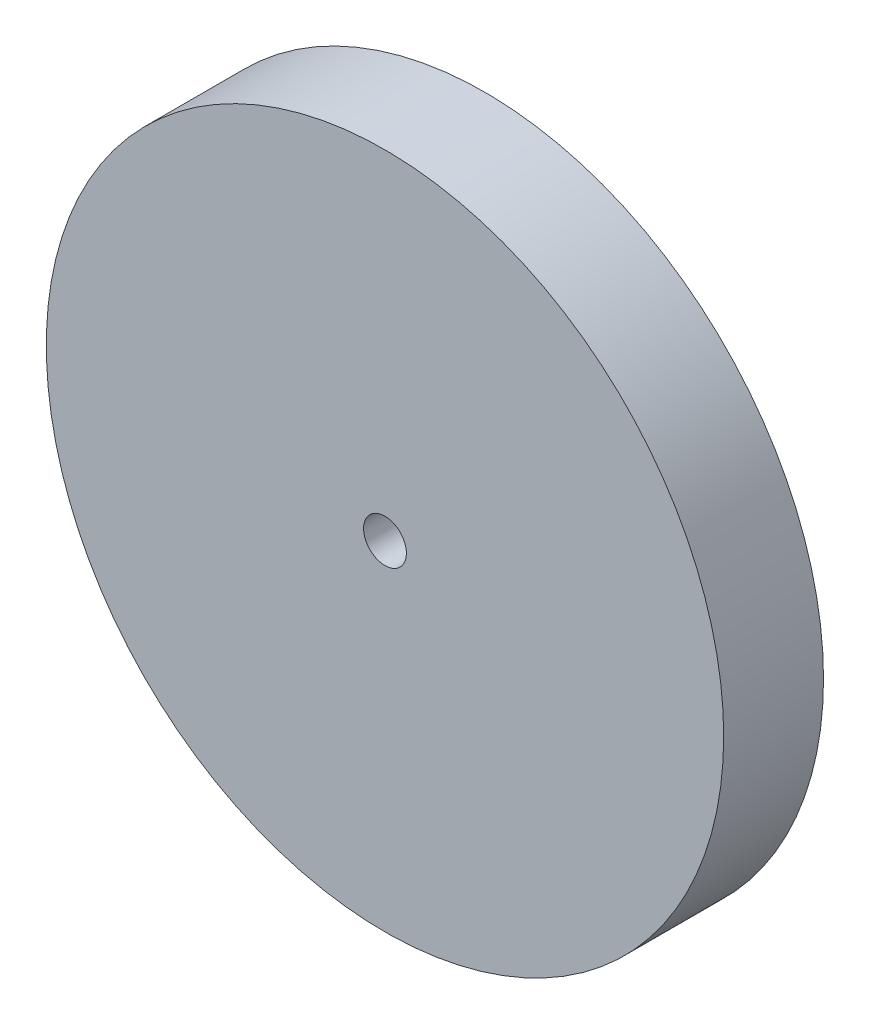
ISO-10303-21;
HEADER;
FILE_DESCRIPTION(('STEP AP214'),'2;1');
FILE_NAME('part.step','',(''),(''),'','','');
FILE_SCHEMA(('AUTOMOTIVE_DESIGN { 1 0 10303 214 1 1 1 1 }'));
ENDSEC;
DATA;
#1=APPLICATION_CONTEXT('core data for automotive mechanical design processes');
#2=APPLICATION_PROTOCOL_DEFINITION('international standard','automotive_design',2000,#1);
#3=PRODUCT_CONTEXT('',#1,'mechanical');
#4=PRODUCT('Part','Part','',(#3));
#5=PRODUCT_RELATED_PRODUCT_CATEGORY('part','',(#4));
#6=PRODUCT_DEFINITION_FORMATION('','',#4);
#7=PRODUCT_DEFINITION_CONTEXT('part definition',#1,'design');
#8=PRODUCT_DEFINITION('design','',#6,#7);
#9=PRODUCT_DEFINITION_SHAPE('','',#8);
#10=(LENGTH_UNIT() NAMED_UNIT(*) SI_UNIT(.MILLI.,.METRE.));
#11=(NAMED_UNIT(*) PLANE_ANGLE_UNIT() SI_UNIT($,.RADIAN.));
#12=(NAMED_UNIT(*) SI_UNIT($,.STERADIAN.) SOLID_ANGLE_UNIT());
#13=UNCERTAINTY_MEASURE_WITH_UNIT(LENGTH_MEASURE(1.E-05),#10,'distance_accuracy_value','');
#14=(GEOMETRIC_REPRESENTATION_CONTEXT(3) GLOBAL_UNCERTAINTY_ASSIGNED_CONTEXT((#13)) GLOBAL_UNIT_ASSIGNED_CONTEXT((#10,
#11,#12)) REPRESENTATION_CONTEXT('',''));
#15=CARTESIAN_POINT('',(0.,0.,0.));
#16=DIRECTION('',(0.,0.,1.));
#17=DIRECTION('',(1.,0.,0.));
#18=AXIS2_PLACEMENT_3D('',#15,#16,#17);
#19=CARTESIAN_POINT('',(0.,0.,0.));
#20=DIRECTION('',(0.,0.,1.));
#21=DIRECTION('',(1.,0.,0.));
#22=AXIS2_PLACEMENT_3D('',#19,#20,#21);
#23=PLANE('',#22);
#24=CARTESIAN_POINT('',(0.,0.,0.));
#25=DIRECTION('',(0.,0.,1.));
#26=DIRECTION('',(1.,0.,0.));
#27=AXIS2_PLACEMENT_3D('',#24,#25,#26);
#28=CIRCLE('',#27,47.5);
#29=CARTESIAN_POINT('',(47.5,0.,0.));
#30=VERTEX_POINT('',#29);
#31=EDGE_CURVE('E44',#30,#30,#28,.T.);
#32=ORIENTED_EDGE('',*,*,#31,.F.);
#33=EDGE_LOOP('',(#32));
#34=FACE_BOUND('',#33,.T.);
#35=CARTESIAN_POINT('',(0.,0.,0.));
#36=DIRECTION('',(0.,0.,1.));
#37=DIRECTION('',(1.,0.,0.));
#38=AXIS2_PLACEMENT_3D('',#35,#36,#37);
#39=CIRCLE('',#38,9.);
#40=CARTESIAN_POINT('',(9.,0.,0.));
#41=VERTEX_POINT('',#40);
#42=EDGE_CURVE('E10',#41,#41,#39,.F.);
#43=ORIENTED_EDGE('',*,*,#42,.F.);
#44=EDGE_LOOP('',(#43));
#45=FACE_BOUND('',#44,.T.);
#46=ADVANCED_FACE('F33',(#34,#45),#23,.F.);
#47=CARTESIAN_POINT('',(0.,0.,14.));
#48=DIRECTION('',(0.,0.,1.));
#49=DIRECTION('',(1.,0.,0.));
#50=AXIS2_PLACEMENT_3D('',#47,#48,#49);
#51=PLANE('',#50);
#52=CARTESIAN_POINT('',(0.,0.,14.));
#53=DIRECTION('',(0.,0.,1.));
#54=DIRECTION('',(1.,0.,0.));
#55=AXIS2_PLACEMENT_3D('',#52,#53,#54);
#56=CIRCLE('',#55,47.5);
#57=CARTESIAN_POINT('',(47.5,0.,14.));
#58=VERTEX_POINT('',#57);
#59=EDGE_CURVE('E40',#58,#58,#56,.T.);
#60=ORIENTED_EDGE('',*,*,#59,.T.);
#61=EDGE_LOOP('',(#60));
#62=FACE_BOUND('',#61,.T.);
#63=CARTESIAN_POINT('',(0.,0.,14.));
#64=DIRECTION('',(0.,0.,1.));
#65=DIRECTION('',(1.,0.,0.));
#66=AXIS2_PLACEMENT_3D('',#63,#64,#65);
#67=CIRCLE('',#66,3.);
#68=CARTESIAN_POINT('',(3.,0.,14.));
#69=VERTEX_POINT('',#68);
#70=EDGE_CURVE('E49',#69,#69,#67,.T.);
#71=ORIENTED_EDGE('',*,*,#70,.F.);
#72=EDGE_LOOP('',(#71));
#73=FACE_BOUND('',#72,.T.);
#74=ADVANCED_FACE('F76',(#62,#73),#51,.T.);
#75=CARTESIAN_POINT('',(0.,0.,14.));
#76=DIRECTION('',(0.,0.,-1.));
#77=DIRECTION('',(-1.,0.,0.));
#78=AXIS2_PLACEMENT_3D('',#75,#76,#77);
#79=CYLINDRICAL_SURFACE('',#78,47.5);
#80=ORIENTED_EDGE('',*,*,#59,.F.);
#81=EDGE_LOOP('',(#80));
#82=FACE_BOUND('',#81,.T.);
#83=ORIENTED_EDGE('',*,*,#31,.T.);
#84=EDGE_LOOP('',(#83));
#85=FACE_BOUND('',#84,.T.);
#86=ADVANCED_FACE('F35',(#82,#85),#79,.T.);
#87=CARTESIAN_POINT('',(0.,0.,14.));
#88=DIRECTION('',(0.,0.,-1.));
#89=DIRECTION('',(-1.,0.,0.));
#90=AXIS2_PLACEMENT_3D('',#87,#88,#89);
#91=CYLINDRICAL_SURFACE('',#90,3.);
#92=ORIENTED_EDGE('',*,*,#70,.T.);
#93=EDGE_LOOP('',(#92));
#94=FACE_BOUND('',#93,.T.);
#95=CARTESIAN_POINT('',(0.,0.,-6.));
#96=DIRECTION('',(0.,0.,-1.));
#97=DIRECTION('',(-1.,0.,0.));
#98=AXIS2_PLACEMENT_3D('',#95,#96,#97);
#99=CIRCLE('',#98,3.);
#100=CARTESIAN_POINT('',(-3.,0.,-6.));
#101=VERTEX_POINT('',#100);
#102=EDGE_CURVE('E56',#101,#101,#99,.T.);
#103=ORIENTED_EDGE('',*,*,#102,.T.);
#104=EDGE_LOOP('',(#103));
#105=FACE_BOUND('',#104,.T.);
#106=ADVANCED_FACE('F60',(#94,#105),#91,.F.);
#107=CARTESIAN_POINT('',(0.,0.,-6.));
#108=DIRECTION('',(0.,0.,-1.));
#109=DIRECTION('',(-1.,0.,0.));
#110=AXIS2_PLACEMENT_3D('',#107,#108,#109);
#111=PLANE('',#110);
#112=CARTESIAN_POINT('',(0.,0.,-6.));
#113=DIRECTION('',(0.,0.,-1.));
#114=DIRECTION('',(-1.,0.,0.));
#115=AXIS2_PLACEMENT_3D('',#112,#113,#114);
#116=CIRCLE('',#115,9.);
#117=CARTESIAN_POINT('',(-9.,0.,-6.));
#118=VERTEX_POINT('',#117);
#119=EDGE_CURVE('E53',#118,#118,#116,.T.);
#120=ORIENTED_EDGE('',*,*,#119,.T.);
#121=EDGE_LOOP('',(#120));
#122=FACE_BOUND('',#121,.T.);
#123=ORIENTED_EDGE('',*,*,#102,.F.);
#124=EDGE_LOOP('',(#123));
#125=FACE_BOUND('',#124,.T.);
#126=ADVANCED_FACE('F62',(#122,#125),#111,.T.);
#127=CARTESIAN_POINT('',(0.,0.,-6.));
#128=DIRECTION('',(0.,0.,1.));
#129=DIRECTION('',(1.,0.,0.));
#130=AXIS2_PLACEMENT_3D('',#127,#128,#129);
#131=CYLINDRICAL_SURFACE('',#130,9.);
#132=ORIENTED_EDGE('',*,*,#119,.F.);
#133=EDGE_LOOP('',(#132));
#134=FACE_BOUND('',#133,.T.);
#135=ORIENTED_EDGE('',*,*,#42,.T.);
#136=EDGE_LOOP('',(#135));
#137=FACE_BOUND('',#136,.T.);
#138=ADVANCED_FACE('F64',(#134,#137),#131,.T.);
#139=CLOSED_SHELL('',(#46,#74,#86,#106,#126,#138));
#140=MANIFOLD_SOLID_BREP('B2',#139);
#141=ADVANCED_BREP_SHAPE_REPRESENTATION('',(#18,#140),#14);
#142=SHAPE_DEFINITION_REPRESENTATION(#9,#141);
ENDSEC;
END-ISO-10303-21;
